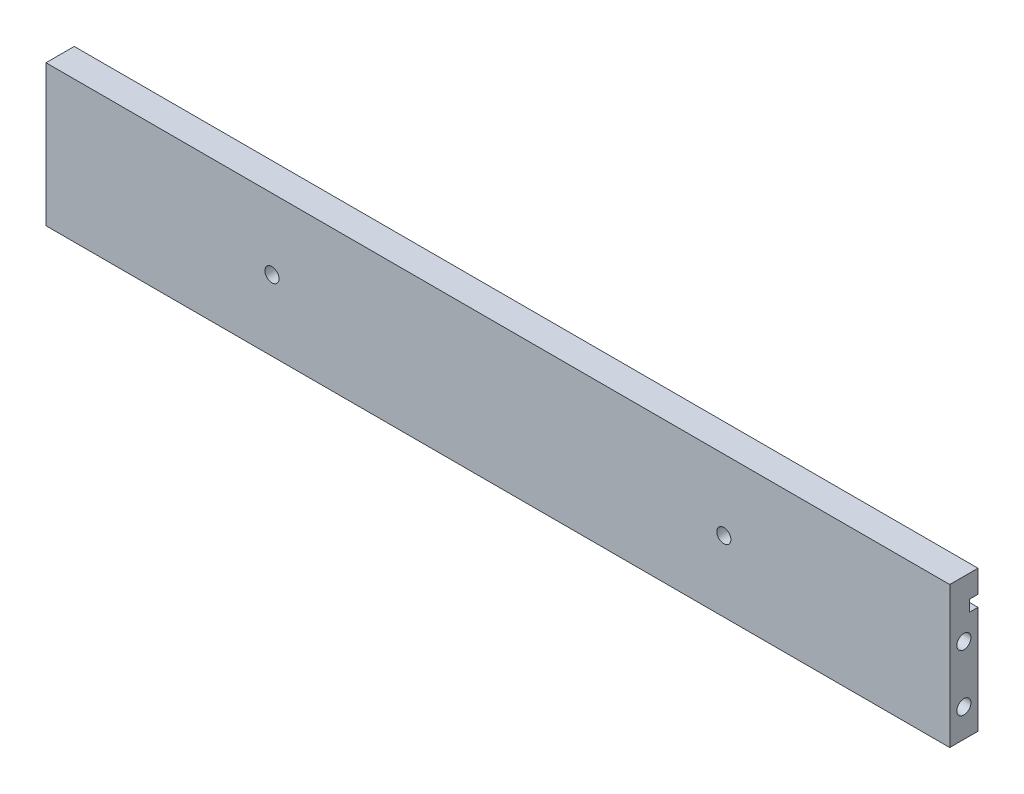
ISO-10303-21;
HEADER;
FILE_DESCRIPTION(('STEP AP214'),'2;1');
FILE_NAME('part.step','',(''),(''),'','','');
FILE_SCHEMA(('AUTOMOTIVE_DESIGN { 1 0 10303 214 1 1 1 1 }'));
ENDSEC;
DATA;
#1=APPLICATION_CONTEXT('core data for automotive mechanical design processes');
#2=APPLICATION_PROTOCOL_DEFINITION('international standard','automotive_design',2000,#1);
#3=PRODUCT_CONTEXT('',#1,'mechanical');
#4=PRODUCT('Part','Part','',(#3));
#5=PRODUCT_RELATED_PRODUCT_CATEGORY('part','',(#4));
#6=PRODUCT_DEFINITION_FORMATION('','',#4);
#7=PRODUCT_DEFINITION_CONTEXT('part definition',#1,'design');
#8=PRODUCT_DEFINITION('design','',#6,#7);
#9=PRODUCT_DEFINITION_SHAPE('','',#8);
#10=(LENGTH_UNIT() NAMED_UNIT(*) SI_UNIT(.MILLI.,.METRE.));
#11=(NAMED_UNIT(*) PLANE_ANGLE_UNIT() SI_UNIT($,.RADIAN.));
#12=(NAMED_UNIT(*) SI_UNIT($,.STERADIAN.) SOLID_ANGLE_UNIT());
#13=UNCERTAINTY_MEASURE_WITH_UNIT(LENGTH_MEASURE(1.E-05),#10,'distance_accuracy_value','');
#14=(GEOMETRIC_REPRESENTATION_CONTEXT(3) GLOBAL_UNCERTAINTY_ASSIGNED_CONTEXT((#13)) GLOBAL_UNIT_ASSIGNED_CONTEXT((#10,
#11,#12)) REPRESENTATION_CONTEXT('',''));
#15=CARTESIAN_POINT('',(0.,0.,0.));
#16=DIRECTION('',(0.,0.,1.));
#17=DIRECTION('',(1.,0.,0.));
#18=AXIS2_PLACEMENT_3D('',#15,#16,#17);
#19=CARTESIAN_POINT('',(0.,0.,0.));
#20=DIRECTION('',(0.,0.,-1.));
#21=DIRECTION('',(-1.,0.,0.));
#22=AXIS2_PLACEMENT_3D('',#19,#20,#21);
#23=PLANE('',#22);
#24=CARTESIAN_POINT('',(40.,12.5,0.));
#25=DIRECTION('',(0.,0.,-1.));
#26=DIRECTION('',(-1.,0.,0.));
#27=AXIS2_PLACEMENT_3D('',#24,#25,#26);
#28=CIRCLE('',#27,1.25000000000001);
#29=CARTESIAN_POINT('',(38.75,12.5,0.));
#30=VERTEX_POINT('',#29);
#31=EDGE_CURVE('E138',#30,#30,#28,.T.);
#32=ORIENTED_EDGE('',*,*,#31,.F.);
#33=EDGE_LOOP('',(#32));
#34=FACE_BOUND('',#33,.T.);
#35=CARTESIAN_POINT('',(120.,12.5,0.));
#36=DIRECTION('',(0.,0.,-1.));
#37=DIRECTION('',(-1.,0.,0.));
#38=AXIS2_PLACEMENT_3D('',#35,#36,#37);
#39=CIRCLE('',#38,1.25);
#40=CARTESIAN_POINT('',(118.75,12.5,0.));
#41=VERTEX_POINT('',#40);
#42=EDGE_CURVE('E327',#41,#41,#39,.T.);
#43=ORIENTED_EDGE('',*,*,#42,.F.);
#44=EDGE_LOOP('',(#43));
#45=FACE_BOUND('',#44,.T.);
#46=DIRECTION('',(-1.,0.,0.));
#47=VECTOR('',#46,1.);
#48=CARTESIAN_POINT('',(160.,19.,0.));
#49=LINE('',#48,#47);
#50=CARTESIAN_POINT('',(160.,19.,0.));
#51=VERTEX_POINT('',#50);
#52=CARTESIAN_POINT('',(0.,19.,0.));
#53=VERTEX_POINT('',#52);
#54=EDGE_CURVE('E147',#51,#53,#49,.T.);
#55=ORIENTED_EDGE('',*,*,#54,.F.);
#56=DIRECTION('',(0.,1.,0.));
#57=VECTOR('',#56,1.);
#58=CARTESIAN_POINT('',(160.,0.,0.));
#59=LINE('',#58,#57);
#60=CARTESIAN_POINT('',(160.,0.,0.));
#61=VERTEX_POINT('',#60);
#62=EDGE_CURVE('E175',#61,#51,#59,.T.);
#63=ORIENTED_EDGE('',*,*,#62,.F.);
#64=DIRECTION('',(1.,0.,0.));
#65=VECTOR('',#64,1.);
#66=CARTESIAN_POINT('',(0.,0.,0.));
#67=LINE('',#66,#65);
#68=CARTESIAN_POINT('',(0.,0.,0.));
#69=VERTEX_POINT('',#68);
#70=EDGE_CURVE('E172',#69,#61,#67,.T.);
#71=ORIENTED_EDGE('',*,*,#70,.F.);
#72=DIRECTION('',(0.,-1.,0.));
#73=VECTOR('',#72,1.);
#74=CARTESIAN_POINT('',(0.,0.,0.));
#75=LINE('',#74,#73);
#76=EDGE_CURVE('E153',#53,#69,#75,.T.);
#77=ORIENTED_EDGE('',*,*,#76,.F.);
#78=EDGE_LOOP('',(#55,#63,#71,#77));
#79=FACE_BOUND('',#78,.T.);
#80=ADVANCED_FACE('F40',(#34,#45,#79),#23,.T.);
#81=CARTESIAN_POINT('',(0.,0.,5.));
#82=DIRECTION('',(1.,0.,0.));
#83=DIRECTION('',(0.,0.,-1.));
#84=AXIS2_PLACEMENT_3D('',#81,#82,#83);
#85=PLANE('',#84);
#86=CARTESIAN_POINT('',(0.,5.,2.5));
#87=DIRECTION('',(-1.,0.,0.));
#88=DIRECTION('',(0.,0.,1.));
#89=AXIS2_PLACEMENT_3D('',#86,#87,#88);
#90=CIRCLE('',#89,1.25);
#91=CARTESIAN_POINT('',(0.,5.,3.75));
#92=VERTEX_POINT('',#91);
#93=EDGE_CURVE('E319',#92,#92,#90,.T.);
#94=ORIENTED_EDGE('',*,*,#93,.F.);
#95=EDGE_LOOP('',(#94));
#96=FACE_BOUND('',#95,.T.);
#97=CARTESIAN_POINT('',(0.,15.,2.5));
#98=DIRECTION('',(-1.,0.,0.));
#99=DIRECTION('',(0.,0.,1.));
#100=AXIS2_PLACEMENT_3D('',#97,#98,#99);
#101=CIRCLE('',#100,1.25);
#102=CARTESIAN_POINT('',(0.,15.,3.75));
#103=VERTEX_POINT('',#102);
#104=EDGE_CURVE('E300',#103,#103,#101,.T.);
#105=ORIENTED_EDGE('',*,*,#104,.F.);
#106=EDGE_LOOP('',(#105));
#107=FACE_BOUND('',#106,.T.);
#108=DIRECTION('',(0.,1.,0.));
#109=VECTOR('',#108,1.);
#110=CARTESIAN_POINT('',(0.,21.,1.5));
#111=LINE('',#110,#109);
#112=CARTESIAN_POINT('',(0.,19.,1.5));
#113=VERTEX_POINT('',#112);
#114=CARTESIAN_POINT('',(0.,21.,1.5));
#115=VERTEX_POINT('',#114);
#116=EDGE_CURVE('E121',#113,#115,#111,.T.);
#117=ORIENTED_EDGE('',*,*,#116,.F.);
#118=DIRECTION('',(0.,0.,1.));
#119=VECTOR('',#118,1.);
#120=CARTESIAN_POINT('',(0.,19.,1.5));
#121=LINE('',#120,#119);
#122=EDGE_CURVE('E133',#53,#113,#121,.T.);
#123=ORIENTED_EDGE('',*,*,#122,.F.);
#124=ORIENTED_EDGE('',*,*,#76,.T.);
#125=DIRECTION('',(0.,0.,-1.));
#126=VECTOR('',#125,1.);
#127=CARTESIAN_POINT('',(0.,0.,5.));
#128=LINE('',#127,#126);
#129=CARTESIAN_POINT('',(0.,0.,5.));
#130=VERTEX_POINT('',#129);
#131=EDGE_CURVE('E11',#130,#69,#128,.T.);
#132=ORIENTED_EDGE('',*,*,#131,.F.);
#133=DIRECTION('',(0.,-1.,0.));
#134=VECTOR('',#133,1.);
#135=CARTESIAN_POINT('',(0.,0.,5.));
#136=LINE('',#135,#134);
#137=CARTESIAN_POINT('',(0.,25.,5.));
#138=VERTEX_POINT('',#137);
#139=EDGE_CURVE('E162',#138,#130,#136,.T.);
#140=ORIENTED_EDGE('',*,*,#139,.F.);
#141=DIRECTION('',(0.,0.,-1.));
#142=VECTOR('',#141,1.);
#143=CARTESIAN_POINT('',(0.,25.,5.));
#144=LINE('',#143,#142);
#145=CARTESIAN_POINT('',(0.,25.,0.));
#146=VERTEX_POINT('',#145);
#147=EDGE_CURVE('E168',#138,#146,#144,.T.);
#148=ORIENTED_EDGE('',*,*,#147,.T.);
#149=CARTESIAN_POINT('',(0.,21.,0.));
#150=VERTEX_POINT('',#149);
#151=EDGE_CURVE('E169',#146,#150,#75,.T.);
#152=ORIENTED_EDGE('',*,*,#151,.T.);
#153=DIRECTION('',(0.,0.,-1.));
#154=VECTOR('',#153,1.);
#155=CARTESIAN_POINT('',(0.,21.,1.5));
#156=LINE('',#155,#154);
#157=EDGE_CURVE('E55',#115,#150,#156,.T.);
#158=ORIENTED_EDGE('',*,*,#157,.F.);
#159=EDGE_LOOP('',(#117,#123,#124,#132,#140,#148,#152,#158));
#160=FACE_BOUND('',#159,.T.);
#161=ADVANCED_FACE('F42',(#96,#107,#160),#85,.F.);
#162=CARTESIAN_POINT('',(0.,0.,5.));
#163=DIRECTION('',(0.,1.,0.));
#164=DIRECTION('',(0.,0.,1.));
#165=AXIS2_PLACEMENT_3D('',#162,#163,#164);
#166=PLANE('',#165);
#167=CARTESIAN_POINT('',(40.,0.,2.5));
#168=DIRECTION('',(0.,-1.,0.));
#169=DIRECTION('',(0.,0.,-1.));
#170=AXIS2_PLACEMENT_3D('',#167,#168,#169);
#171=CIRCLE('',#170,1.25000000000001);
#172=CARTESIAN_POINT('',(40.,0.,1.25));
#173=VERTEX_POINT('',#172);
#174=EDGE_CURVE('E154',#173,#173,#171,.T.);
#175=ORIENTED_EDGE('',*,*,#174,.F.);
#176=EDGE_LOOP('',(#175));
#177=FACE_BOUND('',#176,.T.);
#178=CARTESIAN_POINT('',(120.,0.,2.5));
#179=DIRECTION('',(0.,-1.,0.));
#180=DIRECTION('',(0.,0.,-1.));
#181=AXIS2_PLACEMENT_3D('',#178,#179,#180);
#182=CIRCLE('',#181,1.24);
#183=CARTESIAN_POINT('',(120.,0.,1.26));
#184=VERTEX_POINT('',#183);
#185=EDGE_CURVE('E146',#184,#184,#182,.T.);
#186=ORIENTED_EDGE('',*,*,#185,.F.);
#187=EDGE_LOOP('',(#186));
#188=FACE_BOUND('',#187,.T.);
#189=ORIENTED_EDGE('',*,*,#70,.T.);
#190=DIRECTION('',(0.,0.,-1.));
#191=VECTOR('',#190,1.);
#192=CARTESIAN_POINT('',(160.,0.,5.));
#193=LINE('',#192,#191);
#194=CARTESIAN_POINT('',(160.,0.,5.));
#195=VERTEX_POINT('',#194);
#196=EDGE_CURVE('E48',#195,#61,#193,.T.);
#197=ORIENTED_EDGE('',*,*,#196,.F.);
#198=DIRECTION('',(1.,0.,0.));
#199=VECTOR('',#198,1.);
#200=CARTESIAN_POINT('',(0.,0.,5.));
#201=LINE('',#200,#199);
#202=EDGE_CURVE('E92',#130,#195,#201,.T.);
#203=ORIENTED_EDGE('',*,*,#202,.F.);
#204=ORIENTED_EDGE('',*,*,#131,.T.);
#205=EDGE_LOOP('',(#189,#197,#203,#204));
#206=FACE_BOUND('',#205,.T.);
#207=ADVANCED_FACE('F217',(#177,#188,#206),#166,.F.);
#208=CARTESIAN_POINT('',(160.,0.,5.));
#209=DIRECTION('',(-1.,0.,0.));
#210=DIRECTION('',(0.,0.,1.));
#211=AXIS2_PLACEMENT_3D('',#208,#209,#210);
#212=PLANE('',#211);
#213=CARTESIAN_POINT('',(160.,5.,2.5));
#214=DIRECTION('',(1.,0.,0.));
#215=DIRECTION('',(0.,0.,-1.));
#216=AXIS2_PLACEMENT_3D('',#213,#214,#215);
#217=CIRCLE('',#216,1.25);
#218=CARTESIAN_POINT('',(160.,5.,1.25));
#219=VERTEX_POINT('',#218);
#220=EDGE_CURVE('E301',#219,#219,#217,.T.);
#221=ORIENTED_EDGE('',*,*,#220,.F.);
#222=EDGE_LOOP('',(#221));
#223=FACE_BOUND('',#222,.T.);
#224=CARTESIAN_POINT('',(160.,15.,2.5));
#225=DIRECTION('',(1.,0.,0.));
#226=DIRECTION('',(0.,0.,-1.));
#227=AXIS2_PLACEMENT_3D('',#224,#225,#226);
#228=CIRCLE('',#227,1.25);
#229=CARTESIAN_POINT('',(160.,15.,1.25));
#230=VERTEX_POINT('',#229);
#231=EDGE_CURVE('E312',#230,#230,#228,.T.);
#232=ORIENTED_EDGE('',*,*,#231,.F.);
#233=EDGE_LOOP('',(#232));
#234=FACE_BOUND('',#233,.T.);
#235=ORIENTED_EDGE('',*,*,#62,.T.);
#236=DIRECTION('',(0.,0.,1.));
#237=VECTOR('',#236,1.);
#238=CARTESIAN_POINT('',(160.,19.,1.5));
#239=LINE('',#238,#237);
#240=CARTESIAN_POINT('',(160.,19.,1.5));
#241=VERTEX_POINT('',#240);
#242=EDGE_CURVE('E123',#51,#241,#239,.T.);
#243=ORIENTED_EDGE('',*,*,#242,.T.);
#244=DIRECTION('',(0.,1.,0.));
#245=VECTOR('',#244,1.);
#246=CARTESIAN_POINT('',(160.,21.,1.5));
#247=LINE('',#246,#245);
#248=CARTESIAN_POINT('',(160.,21.,1.5));
#249=VERTEX_POINT('',#248);
#250=EDGE_CURVE('E118',#241,#249,#247,.T.);
#251=ORIENTED_EDGE('',*,*,#250,.T.);
#252=DIRECTION('',(0.,0.,-1.));
#253=VECTOR('',#252,1.);
#254=CARTESIAN_POINT('',(160.,21.,1.5));
#255=LINE('',#254,#253);
#256=CARTESIAN_POINT('',(160.,21.,0.));
#257=VERTEX_POINT('',#256);
#258=EDGE_CURVE('E126',#249,#257,#255,.T.);
#259=ORIENTED_EDGE('',*,*,#258,.T.);
#260=CARTESIAN_POINT('',(160.,25.,0.));
#261=VERTEX_POINT('',#260);
#262=EDGE_CURVE('E174',#257,#261,#59,.T.);
#263=ORIENTED_EDGE('',*,*,#262,.T.);
#264=DIRECTION('',(0.,0.,-1.));
#265=VECTOR('',#264,1.);
#266=CARTESIAN_POINT('',(160.,25.,5.));
#267=LINE('',#266,#265);
#268=CARTESIAN_POINT('',(160.,25.,5.));
#269=VERTEX_POINT('',#268);
#270=EDGE_CURVE('E179',#269,#261,#267,.T.);
#271=ORIENTED_EDGE('',*,*,#270,.F.);
#272=DIRECTION('',(0.,1.,0.));
#273=VECTOR('',#272,1.);
#274=CARTESIAN_POINT('',(160.,0.,5.));
#275=LINE('',#274,#273);
#276=EDGE_CURVE('E165',#195,#269,#275,.T.);
#277=ORIENTED_EDGE('',*,*,#276,.F.);
#278=ORIENTED_EDGE('',*,*,#196,.T.);
#279=EDGE_LOOP('',(#235,#243,#251,#259,#263,#271,#277,#278));
#280=FACE_BOUND('',#279,.T.);
#281=ADVANCED_FACE('F132',(#223,#234,#280),#212,.F.);
#282=CARTESIAN_POINT('',(0.,25.,5.));
#283=DIRECTION('',(0.,-1.,0.));
#284=DIRECTION('',(0.,0.,-1.));
#285=AXIS2_PLACEMENT_3D('',#282,#283,#284);
#286=PLANE('',#285);
#287=DIRECTION('',(-1.,0.,0.));
#288=VECTOR('',#287,1.);
#289=CARTESIAN_POINT('',(0.,25.,0.));
#290=LINE('',#289,#288);
#291=EDGE_CURVE('E85',#261,#146,#290,.T.);
#292=ORIENTED_EDGE('',*,*,#291,.T.);
#293=ORIENTED_EDGE('',*,*,#147,.F.);
#294=DIRECTION('',(-1.,0.,0.));
#295=VECTOR('',#294,1.);
#296=CARTESIAN_POINT('',(0.,25.,5.));
#297=LINE('',#296,#295);
#298=EDGE_CURVE('E64',#269,#138,#297,.T.);
#299=ORIENTED_EDGE('',*,*,#298,.F.);
#300=ORIENTED_EDGE('',*,*,#270,.T.);
#301=EDGE_LOOP('',(#292,#293,#299,#300));
#302=FACE_BOUND('',#301,.T.);
#303=ADVANCED_FACE('F197',(#302),#286,.F.);
#304=CARTESIAN_POINT('',(0.,0.,5.));
#305=DIRECTION('',(0.,0.,-1.));
#306=DIRECTION('',(-1.,0.,0.));
#307=AXIS2_PLACEMENT_3D('',#304,#305,#306);
#308=PLANE('',#307);
#309=CARTESIAN_POINT('',(40.,12.5,5.));
#310=DIRECTION('',(0.,0.,1.));
#311=DIRECTION('',(1.,0.,0.));
#312=AXIS2_PLACEMENT_3D('',#309,#310,#311);
#313=CIRCLE('',#312,1.25000000000001);
#314=CARTESIAN_POINT('',(41.25,12.5,5.));
#315=VERTEX_POINT('',#314);
#316=EDGE_CURVE('E324',#315,#315,#313,.T.);
#317=ORIENTED_EDGE('',*,*,#316,.F.);
#318=EDGE_LOOP('',(#317));
#319=FACE_BOUND('',#318,.T.);
#320=CARTESIAN_POINT('',(120.,12.5,5.));
#321=DIRECTION('',(0.,0.,1.));
#322=DIRECTION('',(1.,0.,0.));
#323=AXIS2_PLACEMENT_3D('',#320,#321,#322);
#324=CIRCLE('',#323,1.25);
#325=CARTESIAN_POINT('',(121.25,12.5,5.));
#326=VERTEX_POINT('',#325);
#327=EDGE_CURVE('E318',#326,#326,#324,.T.);
#328=ORIENTED_EDGE('',*,*,#327,.F.);
#329=EDGE_LOOP('',(#328));
#330=FACE_BOUND('',#329,.T.);
#331=ORIENTED_EDGE('',*,*,#139,.T.);
#332=ORIENTED_EDGE('',*,*,#202,.T.);
#333=ORIENTED_EDGE('',*,*,#276,.T.);
#334=ORIENTED_EDGE('',*,*,#298,.T.);
#335=EDGE_LOOP('',(#331,#332,#333,#334));
#336=FACE_BOUND('',#335,.T.);
#337=ADVANCED_FACE('F198',(#319,#330,#336),#308,.F.);
#338=DIRECTION('',(-1.,0.,0.));
#339=VECTOR('',#338,1.);
#340=CARTESIAN_POINT('',(160.,21.,0.));
#341=LINE('',#340,#339);
#342=EDGE_CURVE('E122',#257,#150,#341,.T.);
#343=ORIENTED_EDGE('',*,*,#342,.T.);
#344=ORIENTED_EDGE('',*,*,#151,.F.);
#345=ORIENTED_EDGE('',*,*,#291,.F.);
#346=ORIENTED_EDGE('',*,*,#262,.F.);
#347=EDGE_LOOP('',(#343,#344,#345,#346));
#348=FACE_BOUND('',#347,.T.);
#349=ADVANCED_FACE('F196',(#348),#23,.T.);
#350=CARTESIAN_POINT('',(120.,10.,2.5));
#351=DIRECTION('',(0.,-1.,0.));
#352=DIRECTION('',(0.,0.,-1.));
#353=AXIS2_PLACEMENT_3D('',#350,#351,#352);
#354=CYLINDRICAL_SURFACE('',#353,1.24);
#355=CARTESIAN_POINT('',(120.,10.,2.5));
#356=DIRECTION('',(0.,-1.,0.));
#357=DIRECTION('',(0.,0.,-1.));
#358=AXIS2_PLACEMENT_3D('',#355,#356,#357);
#359=CIRCLE('',#358,1.24);
#360=CARTESIAN_POINT('',(120.,10.,1.26));
#361=VERTEX_POINT('',#360);
#362=EDGE_CURVE('E157',#361,#361,#359,.T.);
#363=ORIENTED_EDGE('',*,*,#362,.F.);
#364=EDGE_LOOP('',(#363));
#365=FACE_BOUND('',#364,.T.);
#366=ORIENTED_EDGE('',*,*,#185,.T.);
#367=EDGE_LOOP('',(#366));
#368=FACE_BOUND('',#367,.T.);
#369=ADVANCED_FACE('F206',(#365,#368),#354,.F.);
#370=CARTESIAN_POINT('',(120.,10.,2.5));
#371=DIRECTION('',(0.,-1.,0.));
#372=DIRECTION('',(0.,0.,-1.));
#373=AXIS2_PLACEMENT_3D('',#370,#371,#372);
#374=PLANE('',#373);
#375=ORIENTED_EDGE('',*,*,#362,.T.);
#376=EDGE_LOOP('',(#375));
#377=FACE_BOUND('',#376,.T.);
#378=ADVANCED_FACE('F233',(#377),#374,.T.);
#379=CARTESIAN_POINT('',(40.,10.,2.5));
#380=DIRECTION('',(0.,-1.,0.));
#381=DIRECTION('',(0.,0.,-1.));
#382=AXIS2_PLACEMENT_3D('',#379,#380,#381);
#383=CYLINDRICAL_SURFACE('',#382,1.25000000000001);
#384=CARTESIAN_POINT('',(40.,10.,2.5));
#385=DIRECTION('',(0.,-1.,0.));
#386=DIRECTION('',(0.,0.,-1.));
#387=AXIS2_PLACEMENT_3D('',#384,#385,#386);
#388=CIRCLE('',#387,1.25000000000001);
#389=CARTESIAN_POINT('',(40.,10.,1.25));
#390=VERTEX_POINT('',#389);
#391=EDGE_CURVE('E150',#390,#390,#388,.T.);
#392=ORIENTED_EDGE('',*,*,#391,.F.);
#393=EDGE_LOOP('',(#392));
#394=FACE_BOUND('',#393,.T.);
#395=ORIENTED_EDGE('',*,*,#174,.T.);
#396=EDGE_LOOP('',(#395));
#397=FACE_BOUND('',#396,.T.);
#398=ADVANCED_FACE('F238',(#394,#397),#383,.F.);
#399=CARTESIAN_POINT('',(40.,10.,2.5));
#400=DIRECTION('',(0.,-1.,0.));
#401=DIRECTION('',(0.,0.,-1.));
#402=AXIS2_PLACEMENT_3D('',#399,#400,#401);
#403=PLANE('',#402);
#404=ORIENTED_EDGE('',*,*,#391,.T.);
#405=EDGE_LOOP('',(#404));
#406=FACE_BOUND('',#405,.T.);
#407=ADVANCED_FACE('F245',(#406),#403,.T.);
#408=CARTESIAN_POINT('',(160.,21.,1.5));
#409=DIRECTION('',(0.,0.,1.));
#410=DIRECTION('',(0.,-1.,0.));
#411=AXIS2_PLACEMENT_3D('',#408,#409,#410);
#412=PLANE('',#411);
#413=ORIENTED_EDGE('',*,*,#116,.T.);
#414=DIRECTION('',(-1.,0.,0.));
#415=VECTOR('',#414,1.);
#416=CARTESIAN_POINT('',(160.,21.,1.5));
#417=LINE('',#416,#415);
#418=EDGE_CURVE('E114',#249,#115,#417,.T.);
#419=ORIENTED_EDGE('',*,*,#418,.F.);
#420=ORIENTED_EDGE('',*,*,#250,.F.);
#421=DIRECTION('',(-1.,0.,0.));
#422=VECTOR('',#421,1.);
#423=CARTESIAN_POINT('',(160.,19.,1.5));
#424=LINE('',#423,#422);
#425=EDGE_CURVE('E144',#241,#113,#424,.T.);
#426=ORIENTED_EDGE('',*,*,#425,.T.);
#427=EDGE_LOOP('',(#413,#419,#420,#426));
#428=FACE_BOUND('',#427,.T.);
#429=ADVANCED_FACE('F116',(#428),#412,.F.);
#430=CARTESIAN_POINT('',(160.,19.,1.5));
#431=DIRECTION('',(0.,-1.,0.));
#432=DIRECTION('',(0.,0.,-1.));
#433=AXIS2_PLACEMENT_3D('',#430,#431,#432);
#434=PLANE('',#433);
#435=ORIENTED_EDGE('',*,*,#122,.T.);
#436=ORIENTED_EDGE('',*,*,#425,.F.);
#437=ORIENTED_EDGE('',*,*,#242,.F.);
#438=ORIENTED_EDGE('',*,*,#54,.T.);
#439=EDGE_LOOP('',(#435,#436,#437,#438));
#440=FACE_BOUND('',#439,.T.);
#441=ADVANCED_FACE('F190',(#440),#434,.F.);
#442=CARTESIAN_POINT('',(160.,21.,1.5));
#443=DIRECTION('',(0.,1.,0.));
#444=DIRECTION('',(0.,0.,1.));
#445=AXIS2_PLACEMENT_3D('',#442,#443,#444);
#446=PLANE('',#445);
#447=ORIENTED_EDGE('',*,*,#157,.T.);
#448=ORIENTED_EDGE('',*,*,#342,.F.);
#449=ORIENTED_EDGE('',*,*,#258,.F.);
#450=ORIENTED_EDGE('',*,*,#418,.T.);
#451=EDGE_LOOP('',(#447,#448,#449,#450));
#452=FACE_BOUND('',#451,.T.);
#453=ADVANCED_FACE('F127',(#452),#446,.F.);
#454=CARTESIAN_POINT('',(120.,12.5,-5.));
#455=DIRECTION('',(0.,0.,1.));
#456=DIRECTION('',(1.,0.,0.));
#457=AXIS2_PLACEMENT_3D('',#454,#455,#456);
#458=CYLINDRICAL_SURFACE('',#457,1.25);
#459=ORIENTED_EDGE('',*,*,#42,.T.);
#460=EDGE_LOOP('',(#459));
#461=FACE_BOUND('',#460,.T.);
#462=ORIENTED_EDGE('',*,*,#327,.T.);
#463=EDGE_LOOP('',(#462));
#464=FACE_BOUND('',#463,.T.);
#465=ADVANCED_FACE('F254',(#461,#464),#458,.F.);
#466=CARTESIAN_POINT('',(40.,12.5,-5.));
#467=DIRECTION('',(0.,0.,1.));
#468=DIRECTION('',(1.,0.,0.));
#469=AXIS2_PLACEMENT_3D('',#466,#467,#468);
#470=CYLINDRICAL_SURFACE('',#469,1.25000000000001);
#471=ORIENTED_EDGE('',*,*,#31,.T.);
#472=EDGE_LOOP('',(#471));
#473=FACE_BOUND('',#472,.T.);
#474=ORIENTED_EDGE('',*,*,#316,.T.);
#475=EDGE_LOOP('',(#474));
#476=FACE_BOUND('',#475,.T.);
#477=ADVANCED_FACE('F259',(#473,#476),#470,.F.);
#478=CARTESIAN_POINT('',(10.,15.,2.5));
#479=DIRECTION('',(-1.,0.,0.));
#480=DIRECTION('',(0.,0.,1.));
#481=AXIS2_PLACEMENT_3D('',#478,#479,#480);
#482=CYLINDRICAL_SURFACE('',#481,1.25);
#483=CARTESIAN_POINT('',(10.,15.,2.5));
#484=DIRECTION('',(-1.,0.,0.));
#485=DIRECTION('',(0.,0.,1.));
#486=AXIS2_PLACEMENT_3D('',#483,#484,#485);
#487=CIRCLE('',#486,1.25);
#488=CARTESIAN_POINT('',(10.,15.,3.75));
#489=VERTEX_POINT('',#488);
#490=EDGE_CURVE('E304',#489,#489,#487,.T.);
#491=ORIENTED_EDGE('',*,*,#490,.F.);
#492=EDGE_LOOP('',(#491));
#493=FACE_BOUND('',#492,.T.);
#494=ORIENTED_EDGE('',*,*,#104,.T.);
#495=EDGE_LOOP('',(#494));
#496=FACE_BOUND('',#495,.T.);
#497=ADVANCED_FACE('F263',(#493,#496),#482,.F.);
#498=CARTESIAN_POINT('',(10.,15.,2.5));
#499=DIRECTION('',(-1.,0.,0.));
#500=DIRECTION('',(0.,0.,1.));
#501=AXIS2_PLACEMENT_3D('',#498,#499,#500);
#502=PLANE('',#501);
#503=ORIENTED_EDGE('',*,*,#490,.T.);
#504=EDGE_LOOP('',(#503));
#505=FACE_BOUND('',#504,.T.);
#506=ADVANCED_FACE('F267',(#505),#502,.T.);
#507=CARTESIAN_POINT('',(10.,5.,2.5));
#508=DIRECTION('',(-1.,0.,0.));
#509=DIRECTION('',(0.,0.,1.));
#510=AXIS2_PLACEMENT_3D('',#507,#508,#509);
#511=CYLINDRICAL_SURFACE('',#510,1.25);
#512=CARTESIAN_POINT('',(10.,5.,2.5));
#513=DIRECTION('',(-1.,0.,0.));
#514=DIRECTION('',(0.,0.,1.));
#515=AXIS2_PLACEMENT_3D('',#512,#513,#514);
#516=CIRCLE('',#515,1.25);
#517=CARTESIAN_POINT('',(10.,5.,3.75));
#518=VERTEX_POINT('',#517);
#519=EDGE_CURVE('E315',#518,#518,#516,.T.);
#520=ORIENTED_EDGE('',*,*,#519,.F.);
#521=EDGE_LOOP('',(#520));
#522=FACE_BOUND('',#521,.T.);
#523=ORIENTED_EDGE('',*,*,#93,.T.);
#524=EDGE_LOOP('',(#523));
#525=FACE_BOUND('',#524,.T.);
#526=ADVANCED_FACE('F271',(#522,#525),#511,.F.);
#527=CARTESIAN_POINT('',(10.,5.,2.5));
#528=DIRECTION('',(-1.,0.,0.));
#529=DIRECTION('',(0.,0.,1.));
#530=AXIS2_PLACEMENT_3D('',#527,#528,#529);
#531=PLANE('',#530);
#532=ORIENTED_EDGE('',*,*,#519,.T.);
#533=EDGE_LOOP('',(#532));
#534=FACE_BOUND('',#533,.T.);
#535=ADVANCED_FACE('F275',(#534),#531,.T.);
#536=CARTESIAN_POINT('',(150.,15.,2.5));
#537=DIRECTION('',(1.,0.,0.));
#538=DIRECTION('',(0.,0.,-1.));
#539=AXIS2_PLACEMENT_3D('',#536,#537,#538);
#540=CYLINDRICAL_SURFACE('',#539,1.25);
#541=CARTESIAN_POINT('',(150.,15.,2.5));
#542=DIRECTION('',(1.,0.,0.));
#543=DIRECTION('',(0.,0.,-1.));
#544=AXIS2_PLACEMENT_3D('',#541,#542,#543);
#545=CIRCLE('',#544,1.25);
#546=CARTESIAN_POINT('',(150.,15.,1.25));
#547=VERTEX_POINT('',#546);
#548=EDGE_CURVE('E307',#547,#547,#545,.T.);
#549=ORIENTED_EDGE('',*,*,#548,.F.);
#550=EDGE_LOOP('',(#549));
#551=FACE_BOUND('',#550,.T.);
#552=ORIENTED_EDGE('',*,*,#231,.T.);
#553=EDGE_LOOP('',(#552));
#554=FACE_BOUND('',#553,.T.);
#555=ADVANCED_FACE('F279',(#551,#554),#540,.F.);
#556=CARTESIAN_POINT('',(150.,15.,2.5));
#557=DIRECTION('',(1.,0.,0.));
#558=DIRECTION('',(0.,0.,-1.));
#559=AXIS2_PLACEMENT_3D('',#556,#557,#558);
#560=PLANE('',#559);
#561=ORIENTED_EDGE('',*,*,#548,.T.);
#562=EDGE_LOOP('',(#561));
#563=FACE_BOUND('',#562,.T.);
#564=ADVANCED_FACE('F283',(#563),#560,.T.);
#565=CARTESIAN_POINT('',(150.,5.,2.5));
#566=DIRECTION('',(1.,0.,0.));
#567=DIRECTION('',(0.,0.,-1.));
#568=AXIS2_PLACEMENT_3D('',#565,#566,#567);
#569=CYLINDRICAL_SURFACE('',#568,1.25);
#570=CARTESIAN_POINT('',(150.,5.,2.5));
#571=DIRECTION('',(1.,0.,0.));
#572=DIRECTION('',(0.,0.,-1.));
#573=AXIS2_PLACEMENT_3D('',#570,#571,#572);
#574=CIRCLE('',#573,1.25);
#575=CARTESIAN_POINT('',(150.,5.,1.25));
#576=VERTEX_POINT('',#575);
#577=EDGE_CURVE('E299',#576,#576,#574,.T.);
#578=ORIENTED_EDGE('',*,*,#577,.F.);
#579=EDGE_LOOP('',(#578));
#580=FACE_BOUND('',#579,.T.);
#581=ORIENTED_EDGE('',*,*,#220,.T.);
#582=EDGE_LOOP('',(#581));
#583=FACE_BOUND('',#582,.T.);
#584=ADVANCED_FACE('F287',(#580,#583),#569,.F.);
#585=CARTESIAN_POINT('',(150.,5.,2.5));
#586=DIRECTION('',(1.,0.,0.));
#587=DIRECTION('',(0.,0.,-1.));
#588=AXIS2_PLACEMENT_3D('',#585,#586,#587);
#589=PLANE('',#588);
#590=ORIENTED_EDGE('',*,*,#577,.T.);
#591=EDGE_LOOP('',(#590));
#592=FACE_BOUND('',#591,.T.);
#593=ADVANCED_FACE('F291',(#592),#589,.T.);
#594=CLOSED_SHELL('',(#80,#161,#207,#281,#303,#337,#349,#369,#378,#398,#407,#429,#441,#453,#465,
#477,#497,#506,#526,#535,#555,#564,#584,#593));
#595=MANIFOLD_SOLID_BREP('B2',#594);
#596=ADVANCED_BREP_SHAPE_REPRESENTATION('',(#18,#595),#14);
#597=SHAPE_DEFINITION_REPRESENTATION(#9,#596);
ENDSEC;
END-ISO-10303-21;
